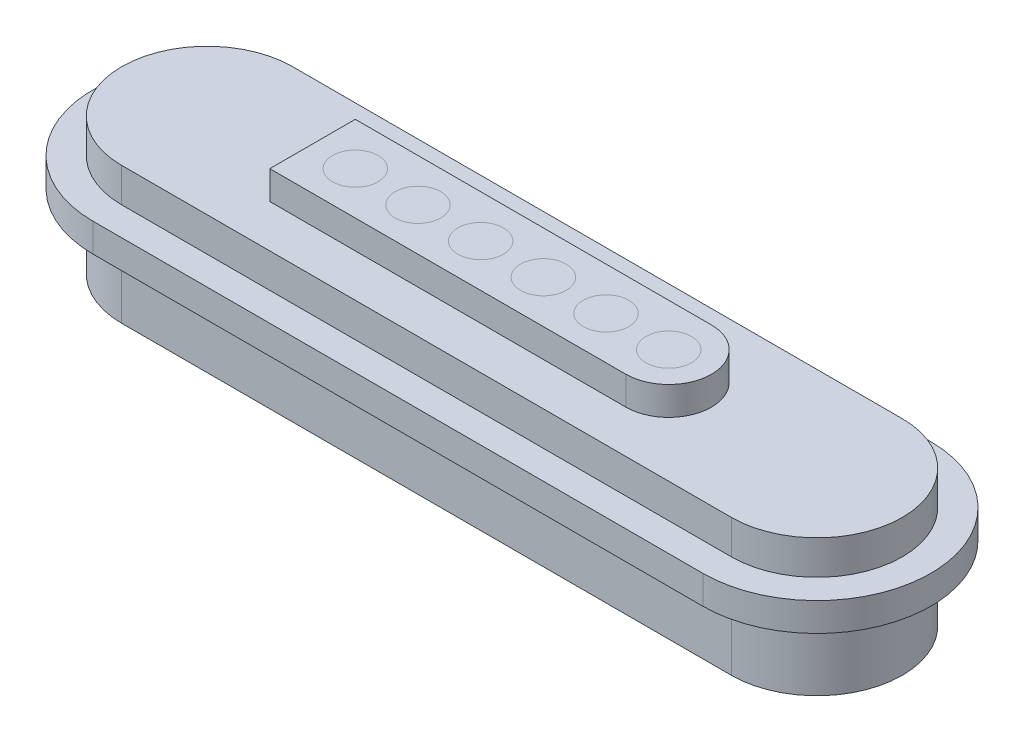
ISO-10303-21;
HEADER;
FILE_DESCRIPTION(('STEP AP214'),'2;1');
FILE_NAME('part.step','',(''),(''),'','','');
FILE_SCHEMA(('AUTOMOTIVE_DESIGN { 1 0 10303 214 1 1 1 1 }'));
ENDSEC;
DATA;
#1=APPLICATION_CONTEXT('core data for automotive mechanical design processes');
#2=APPLICATION_PROTOCOL_DEFINITION('international standard','automotive_design',2000,#1);
#3=PRODUCT_CONTEXT('',#1,'mechanical');
#4=PRODUCT('Part','Part','',(#3));
#5=PRODUCT_RELATED_PRODUCT_CATEGORY('part','',(#4));
#6=PRODUCT_DEFINITION_FORMATION('','',#4);
#7=PRODUCT_DEFINITION_CONTEXT('part definition',#1,'design');
#8=PRODUCT_DEFINITION('design','',#6,#7);
#9=PRODUCT_DEFINITION_SHAPE('','',#8);
#10=(LENGTH_UNIT() NAMED_UNIT(*) SI_UNIT(.MILLI.,.METRE.));
#11=(NAMED_UNIT(*) PLANE_ANGLE_UNIT() SI_UNIT($,.RADIAN.));
#12=(NAMED_UNIT(*) SI_UNIT($,.STERADIAN.) SOLID_ANGLE_UNIT());
#13=UNCERTAINTY_MEASURE_WITH_UNIT(LENGTH_MEASURE(1.E-05),#10,'distance_accuracy_value','');
#14=(GEOMETRIC_REPRESENTATION_CONTEXT(3) GLOBAL_UNCERTAINTY_ASSIGNED_CONTEXT((#13)) GLOBAL_UNIT_ASSIGNED_CONTEXT((#10,
#11,#12)) REPRESENTATION_CONTEXT('',''));
#15=CARTESIAN_POINT('',(0.,0.,0.));
#16=DIRECTION('',(0.,0.,1.));
#17=DIRECTION('',(1.,0.,0.));
#18=AXIS2_PLACEMENT_3D('',#15,#16,#17);
#19=CARTESIAN_POINT('',(16.2,-1.5,0.));
#20=DIRECTION('',(0.,1.,0.));
#21=DIRECTION('',(0.,0.,1.));
#22=AXIS2_PLACEMENT_3D('',#19,#20,#21);
#23=CYLINDRICAL_SURFACE('',#22,0.799999999999999);
#24=CARTESIAN_POINT('',(16.2,-1.5,0.));
#25=DIRECTION('',(0.,1.,0.));
#26=DIRECTION('',(0.,0.,1.));
#27=AXIS2_PLACEMENT_3D('',#24,#25,#26);
#28=CIRCLE('',#27,0.799999999999999);
#29=CARTESIAN_POINT('',(16.2,-1.5,0.799999999999999));
#30=VERTEX_POINT('',#29);
#31=EDGE_CURVE('E11',#30,#30,#28,.T.);
#32=ORIENTED_EDGE('',*,*,#31,.T.);
#33=EDGE_LOOP('',(#32));
#34=FACE_BOUND('',#33,.T.);
#35=CARTESIAN_POINT('',(16.2,5.8,0.));
#36=DIRECTION('',(0.,1.,0.));
#37=DIRECTION('',(0.,0.,1.));
#38=AXIS2_PLACEMENT_3D('',#35,#36,#37);
#39=CIRCLE('',#38,0.799999999999999);
#40=CARTESIAN_POINT('',(16.2,5.8,0.799999999999999));
#41=VERTEX_POINT('',#40);
#42=EDGE_CURVE('E56',#41,#41,#39,.T.);
#43=ORIENTED_EDGE('',*,*,#42,.F.);
#44=EDGE_LOOP('',(#43));
#45=FACE_BOUND('',#44,.T.);
#46=ADVANCED_FACE('F50',(#34,#45),#23,.T.);
#47=CARTESIAN_POINT('',(0.,-1.5,0.));
#48=DIRECTION('',(0.,1.,0.));
#49=DIRECTION('',(0.,0.,1.));
#50=AXIS2_PLACEMENT_3D('',#47,#48,#49);
#51=PLANE('',#50);
#52=ORIENTED_EDGE('',*,*,#31,.F.);
#53=EDGE_LOOP('',(#52));
#54=FACE_BOUND('',#53,.T.);
#55=ADVANCED_FACE('F65',(#54),#51,.F.);
#56=CARTESIAN_POINT('',(0.,5.8,0.));
#57=DIRECTION('',(0.,1.,0.));
#58=DIRECTION('',(0.,0.,1.));
#59=AXIS2_PLACEMENT_3D('',#56,#57,#58);
#60=PLANE('',#59);
#61=ORIENTED_EDGE('',*,*,#42,.T.);
#62=EDGE_LOOP('',(#61));
#63=FACE_BOUND('',#62,.T.);
#64=ADVANCED_FACE('F62',(#63),#60,.T.);
#65=CLOSED_SHELL('',(#46,#55,#64));
#66=MANIFOLD_SOLID_BREP('B2',#65);
#67=CARTESIAN_POINT('',(14.,-1.5,0.));
#68=DIRECTION('',(0.,1.,0.));
#69=DIRECTION('',(0.,0.,1.));
#70=AXIS2_PLACEMENT_3D('',#67,#68,#69);
#71=CYLINDRICAL_SURFACE('',#70,0.800000000000001);
#72=CARTESIAN_POINT('',(14.,-1.5,0.));
#73=DIRECTION('',(0.,1.,0.));
#74=DIRECTION('',(0.,0.,1.));
#75=AXIS2_PLACEMENT_3D('',#72,#73,#74);
#76=CIRCLE('',#75,0.800000000000001);
#77=CARTESIAN_POINT('',(14.,-1.5,0.800000000000001));
#78=VERTEX_POINT('',#77);
#79=EDGE_CURVE('E49',#78,#78,#76,.T.);
#80=ORIENTED_EDGE('',*,*,#79,.T.);
#81=EDGE_LOOP('',(#80));
#82=FACE_BOUND('',#81,.T.);
#83=CARTESIAN_POINT('',(14.,5.8,0.));
#84=DIRECTION('',(0.,1.,0.));
#85=DIRECTION('',(0.,0.,1.));
#86=AXIS2_PLACEMENT_3D('',#83,#84,#85);
#87=CIRCLE('',#86,0.800000000000001);
#88=CARTESIAN_POINT('',(14.,5.8,0.800000000000001));
#89=VERTEX_POINT('',#88);
#90=EDGE_CURVE('E107',#89,#89,#87,.T.);
#91=ORIENTED_EDGE('',*,*,#90,.F.);
#92=EDGE_LOOP('',(#91));
#93=FACE_BOUND('',#92,.T.);
#94=ADVANCED_FACE('F101',(#82,#93),#71,.T.);
#95=CARTESIAN_POINT('',(0.,-1.5,0.));
#96=DIRECTION('',(0.,1.,0.));
#97=DIRECTION('',(0.,0.,1.));
#98=AXIS2_PLACEMENT_3D('',#95,#96,#97);
#99=PLANE('',#98);
#100=ORIENTED_EDGE('',*,*,#79,.F.);
#101=EDGE_LOOP('',(#100));
#102=FACE_BOUND('',#101,.T.);
#103=ADVANCED_FACE('F116',(#102),#99,.F.);
#104=CARTESIAN_POINT('',(0.,5.8,0.));
#105=DIRECTION('',(0.,1.,0.));
#106=DIRECTION('',(0.,0.,1.));
#107=AXIS2_PLACEMENT_3D('',#104,#105,#106);
#108=PLANE('',#107);
#109=ORIENTED_EDGE('',*,*,#90,.T.);
#110=EDGE_LOOP('',(#109));
#111=FACE_BOUND('',#110,.T.);
#112=ADVANCED_FACE('F113',(#111),#108,.T.);
#113=CLOSED_SHELL('',(#94,#103,#112));
#114=MANIFOLD_SOLID_BREP('B6',#113);
#115=CARTESIAN_POINT('',(11.8,-1.5,0.));
#116=DIRECTION('',(0.,1.,0.));
#117=DIRECTION('',(0.,0.,1.));
#118=AXIS2_PLACEMENT_3D('',#115,#116,#117);
#119=CYLINDRICAL_SURFACE('',#118,0.800000000000001);
#120=CARTESIAN_POINT('',(11.8,-1.5,0.));
#121=DIRECTION('',(0.,1.,0.));
#122=DIRECTION('',(0.,0.,1.));
#123=AXIS2_PLACEMENT_3D('',#120,#121,#122);
#124=CIRCLE('',#123,0.800000000000001);
#125=CARTESIAN_POINT('',(11.8,-1.5,0.800000000000001));
#126=VERTEX_POINT('',#125);
#127=EDGE_CURVE('E100',#126,#126,#124,.T.);
#128=ORIENTED_EDGE('',*,*,#127,.T.);
#129=EDGE_LOOP('',(#128));
#130=FACE_BOUND('',#129,.T.);
#131=CARTESIAN_POINT('',(11.8,5.8,0.));
#132=DIRECTION('',(0.,1.,0.));
#133=DIRECTION('',(0.,0.,1.));
#134=AXIS2_PLACEMENT_3D('',#131,#132,#133);
#135=CIRCLE('',#134,0.800000000000001);
#136=CARTESIAN_POINT('',(11.8,5.8,0.800000000000001));
#137=VERTEX_POINT('',#136);
#138=EDGE_CURVE('E158',#137,#137,#135,.T.);
#139=ORIENTED_EDGE('',*,*,#138,.F.);
#140=EDGE_LOOP('',(#139));
#141=FACE_BOUND('',#140,.T.);
#142=ADVANCED_FACE('F152',(#130,#141),#119,.T.);
#143=CARTESIAN_POINT('',(0.,-1.5,0.));
#144=DIRECTION('',(0.,1.,0.));
#145=DIRECTION('',(0.,0.,1.));
#146=AXIS2_PLACEMENT_3D('',#143,#144,#145);
#147=PLANE('',#146);
#148=ORIENTED_EDGE('',*,*,#127,.F.);
#149=EDGE_LOOP('',(#148));
#150=FACE_BOUND('',#149,.T.);
#151=ADVANCED_FACE('F167',(#150),#147,.F.);
#152=CARTESIAN_POINT('',(0.,5.8,0.));
#153=DIRECTION('',(0.,1.,0.));
#154=DIRECTION('',(0.,0.,1.));
#155=AXIS2_PLACEMENT_3D('',#152,#153,#154);
#156=PLANE('',#155);
#157=ORIENTED_EDGE('',*,*,#138,.T.);
#158=EDGE_LOOP('',(#157));
#159=FACE_BOUND('',#158,.T.);
#160=ADVANCED_FACE('F164',(#159),#156,.T.);
#161=CLOSED_SHELL('',(#142,#151,#160));
#162=MANIFOLD_SOLID_BREP('B44',#161);
#163=CARTESIAN_POINT('',(9.6,-1.5,0.));
#164=DIRECTION('',(0.,1.,0.));
#165=DIRECTION('',(0.,0.,1.));
#166=AXIS2_PLACEMENT_3D('',#163,#164,#165);
#167=CYLINDRICAL_SURFACE('',#166,0.800000000000001);
#168=CARTESIAN_POINT('',(9.6,-1.5,0.));
#169=DIRECTION('',(0.,1.,0.));
#170=DIRECTION('',(0.,0.,1.));
#171=AXIS2_PLACEMENT_3D('',#168,#169,#170);
#172=CIRCLE('',#171,0.800000000000001);
#173=CARTESIAN_POINT('',(9.6,-1.5,0.800000000000001));
#174=VERTEX_POINT('',#173);
#175=EDGE_CURVE('E151',#174,#174,#172,.F.);
#176=ORIENTED_EDGE('',*,*,#175,.F.);
#177=EDGE_LOOP('',(#176));
#178=FACE_BOUND('',#177,.T.);
#179=CARTESIAN_POINT('',(9.6,5.8,0.));
#180=DIRECTION('',(0.,1.,0.));
#181=DIRECTION('',(0.,0.,1.));
#182=AXIS2_PLACEMENT_3D('',#179,#180,#181);
#183=CIRCLE('',#182,0.800000000000001);
#184=CARTESIAN_POINT('',(9.6,5.8,0.800000000000001));
#185=VERTEX_POINT('',#184);
#186=EDGE_CURVE('E209',#185,#185,#183,.F.);
#187=ORIENTED_EDGE('',*,*,#186,.T.);
#188=EDGE_LOOP('',(#187));
#189=FACE_BOUND('',#188,.T.);
#190=ADVANCED_FACE('F203',(#178,#189),#167,.T.);
#191=CARTESIAN_POINT('',(0.,-1.5,0.));
#192=DIRECTION('',(0.,1.,0.));
#193=DIRECTION('',(0.,0.,1.));
#194=AXIS2_PLACEMENT_3D('',#191,#192,#193);
#195=PLANE('',#194);
#196=ORIENTED_EDGE('',*,*,#175,.T.);
#197=EDGE_LOOP('',(#196));
#198=FACE_BOUND('',#197,.T.);
#199=ADVANCED_FACE('F218',(#198),#195,.F.);
#200=CARTESIAN_POINT('',(0.,5.8,0.));
#201=DIRECTION('',(0.,1.,0.));
#202=DIRECTION('',(0.,0.,1.));
#203=AXIS2_PLACEMENT_3D('',#200,#201,#202);
#204=PLANE('',#203);
#205=ORIENTED_EDGE('',*,*,#186,.F.);
#206=EDGE_LOOP('',(#205));
#207=FACE_BOUND('',#206,.T.);
#208=ADVANCED_FACE('F216',(#207),#204,.T.);
#209=CLOSED_SHELL('',(#190,#199,#208));
#210=MANIFOLD_SOLID_BREP('B95',#209);
#211=CARTESIAN_POINT('',(7.4,-1.5,0.));
#212=DIRECTION('',(0.,1.,0.));
#213=DIRECTION('',(0.,0.,1.));
#214=AXIS2_PLACEMENT_3D('',#211,#212,#213);
#215=CYLINDRICAL_SURFACE('',#214,0.800000000000001);
#216=CARTESIAN_POINT('',(7.4,-1.5,0.));
#217=DIRECTION('',(0.,1.,0.));
#218=DIRECTION('',(0.,0.,1.));
#219=AXIS2_PLACEMENT_3D('',#216,#217,#218);
#220=CIRCLE('',#219,0.800000000000001);
#221=CARTESIAN_POINT('',(7.4,-1.5,0.800000000000001));
#222=VERTEX_POINT('',#221);
#223=EDGE_CURVE('E202',#222,#222,#220,.F.);
#224=ORIENTED_EDGE('',*,*,#223,.F.);
#225=EDGE_LOOP('',(#224));
#226=FACE_BOUND('',#225,.T.);
#227=CARTESIAN_POINT('',(7.4,5.8,0.));
#228=DIRECTION('',(0.,1.,0.));
#229=DIRECTION('',(0.,0.,1.));
#230=AXIS2_PLACEMENT_3D('',#227,#228,#229);
#231=CIRCLE('',#230,0.800000000000001);
#232=CARTESIAN_POINT('',(7.4,5.8,0.800000000000001));
#233=VERTEX_POINT('',#232);
#234=EDGE_CURVE('E260',#233,#233,#231,.F.);
#235=ORIENTED_EDGE('',*,*,#234,.T.);
#236=EDGE_LOOP('',(#235));
#237=FACE_BOUND('',#236,.T.);
#238=ADVANCED_FACE('F254',(#226,#237),#215,.T.);
#239=CARTESIAN_POINT('',(0.,-1.5,0.));
#240=DIRECTION('',(0.,1.,0.));
#241=DIRECTION('',(0.,0.,1.));
#242=AXIS2_PLACEMENT_3D('',#239,#240,#241);
#243=PLANE('',#242);
#244=ORIENTED_EDGE('',*,*,#223,.T.);
#245=EDGE_LOOP('',(#244));
#246=FACE_BOUND('',#245,.T.);
#247=ADVANCED_FACE('F269',(#246),#243,.F.);
#248=CARTESIAN_POINT('',(0.,5.8,0.));
#249=DIRECTION('',(0.,1.,0.));
#250=DIRECTION('',(0.,0.,1.));
#251=AXIS2_PLACEMENT_3D('',#248,#249,#250);
#252=PLANE('',#251);
#253=ORIENTED_EDGE('',*,*,#234,.F.);
#254=EDGE_LOOP('',(#253));
#255=FACE_BOUND('',#254,.T.);
#256=ADVANCED_FACE('F267',(#255),#252,.T.);
#257=CLOSED_SHELL('',(#238,#247,#256));
#258=MANIFOLD_SOLID_BREP('B146',#257);
#259=CARTESIAN_POINT('',(5.2,-1.5,0.));
#260=DIRECTION('',(0.,1.,0.));
#261=DIRECTION('',(0.,0.,1.));
#262=AXIS2_PLACEMENT_3D('',#259,#260,#261);
#263=CYLINDRICAL_SURFACE('',#262,0.800000000000001);
#264=CARTESIAN_POINT('',(5.2,-1.5,0.));
#265=DIRECTION('',(0.,1.,0.));
#266=DIRECTION('',(0.,0.,1.));
#267=AXIS2_PLACEMENT_3D('',#264,#265,#266);
#268=CIRCLE('',#267,0.800000000000001);
#269=CARTESIAN_POINT('',(5.2,-1.5,0.800000000000001));
#270=VERTEX_POINT('',#269);
#271=EDGE_CURVE('E253',#270,#270,#268,.F.);
#272=ORIENTED_EDGE('',*,*,#271,.F.);
#273=EDGE_LOOP('',(#272));
#274=FACE_BOUND('',#273,.T.);
#275=CARTESIAN_POINT('',(5.2,5.8,0.));
#276=DIRECTION('',(0.,1.,0.));
#277=DIRECTION('',(0.,0.,1.));
#278=AXIS2_PLACEMENT_3D('',#275,#276,#277);
#279=CIRCLE('',#278,0.800000000000001);
#280=CARTESIAN_POINT('',(5.2,5.8,0.800000000000001));
#281=VERTEX_POINT('',#280);
#282=EDGE_CURVE('E312',#281,#281,#279,.F.);
#283=ORIENTED_EDGE('',*,*,#282,.T.);
#284=EDGE_LOOP('',(#283));
#285=FACE_BOUND('',#284,.T.);
#286=ADVANCED_FACE('F306',(#274,#285),#263,.T.);
#287=CARTESIAN_POINT('',(0.,-1.5,0.));
#288=DIRECTION('',(0.,1.,0.));
#289=DIRECTION('',(0.,0.,1.));
#290=AXIS2_PLACEMENT_3D('',#287,#288,#289);
#291=PLANE('',#290);
#292=ORIENTED_EDGE('',*,*,#271,.T.);
#293=EDGE_LOOP('',(#292));
#294=FACE_BOUND('',#293,.T.);
#295=ADVANCED_FACE('F321',(#294),#291,.F.);
#296=CARTESIAN_POINT('',(0.,5.8,0.));
#297=DIRECTION('',(0.,1.,0.));
#298=DIRECTION('',(0.,0.,1.));
#299=AXIS2_PLACEMENT_3D('',#296,#297,#298);
#300=PLANE('',#299);
#301=ORIENTED_EDGE('',*,*,#282,.F.);
#302=EDGE_LOOP('',(#301));
#303=FACE_BOUND('',#302,.T.);
#304=ADVANCED_FACE('F319',(#303),#300,.T.);
#305=CLOSED_SHELL('',(#286,#295,#304));
#306=MANIFOLD_SOLID_BREP('B197',#305);
#307=CARTESIAN_POINT('',(0.,4.8,3.));
#308=DIRECTION('',(0.,0.,-1.));
#309=DIRECTION('',(-1.,0.,0.));
#310=AXIS2_PLACEMENT_3D('',#307,#308,#309);
#311=PLANE('',#310);
#312=DIRECTION('',(1.,0.,0.));
#313=VECTOR('',#312,1.);
#314=CARTESIAN_POINT('',(0.,2.6,3.));
#315=LINE('',#314,#313);
#316=CARTESIAN_POINT('',(0.,2.6,3.));
#317=VERTEX_POINT('',#316);
#318=CARTESIAN_POINT('',(21.4,2.6,3.));
#319=VERTEX_POINT('',#318);
#320=EDGE_CURVE('E558',#317,#319,#315,.T.);
#321=ORIENTED_EDGE('',*,*,#320,.F.);
#322=DIRECTION('',(0.,-1.,0.));
#323=VECTOR('',#322,1.);
#324=CARTESIAN_POINT('',(0.,4.8,3.));
#325=LINE('',#324,#323);
#326=CARTESIAN_POINT('',(0.,0.,3.));
#327=VERTEX_POINT('',#326);
#328=EDGE_CURVE('E520',#317,#327,#325,.T.);
#329=ORIENTED_EDGE('',*,*,#328,.T.);
#330=DIRECTION('',(1.,0.,0.));
#331=VECTOR('',#330,1.);
#332=CARTESIAN_POINT('',(0.,0.,3.));
#333=LINE('',#332,#331);
#334=CARTESIAN_POINT('',(21.4,0.,3.));
#335=VERTEX_POINT('',#334);
#336=EDGE_CURVE('E521',#327,#335,#333,.T.);
#337=ORIENTED_EDGE('',*,*,#336,.T.);
#338=DIRECTION('',(0.,-1.,0.));
#339=VECTOR('',#338,1.);
#340=CARTESIAN_POINT('',(21.4,4.8,3.));
#341=LINE('',#340,#339);
#342=EDGE_CURVE('E357',#319,#335,#341,.T.);
#343=ORIENTED_EDGE('',*,*,#342,.F.);
#344=EDGE_LOOP('',(#321,#329,#337,#343));
#345=FACE_BOUND('',#344,.T.);
#346=ADVANCED_FACE('F349',(#345),#311,.F.);
#347=CARTESIAN_POINT('',(21.4,4.8,0.));
#348=DIRECTION('',(0.,-1.,0.));
#349=DIRECTION('',(0.,0.,-1.));
#350=AXIS2_PLACEMENT_3D('',#347,#348,#349);
#351=CYLINDRICAL_SURFACE('',#350,3.);
#352=CARTESIAN_POINT('',(21.4,2.6,0.));
#353=DIRECTION('',(0.,1.,0.));
#354=DIRECTION('',(0.,0.,1.));
#355=AXIS2_PLACEMENT_3D('',#352,#353,#354);
#356=CIRCLE('',#355,3.);
#357=CARTESIAN_POINT('',(21.4,2.6,-3.));
#358=VERTEX_POINT('',#357);
#359=EDGE_CURVE('E364',#319,#358,#356,.T.);
#360=ORIENTED_EDGE('',*,*,#359,.F.);
#361=ORIENTED_EDGE('',*,*,#342,.T.);
#362=CARTESIAN_POINT('',(21.4,0.,0.));
#363=DIRECTION('',(0.,1.,0.));
#364=DIRECTION('',(0.,0.,1.));
#365=AXIS2_PLACEMENT_3D('',#362,#363,#364);
#366=CIRCLE('',#365,3.);
#367=CARTESIAN_POINT('',(21.4,0.,-3.));
#368=VERTEX_POINT('',#367);
#369=EDGE_CURVE('E524',#335,#368,#366,.T.);
#370=ORIENTED_EDGE('',*,*,#369,.T.);
#371=DIRECTION('',(0.,-1.,0.));
#372=VECTOR('',#371,1.);
#373=CARTESIAN_POINT('',(21.4,4.8,-3.));
#374=LINE('',#373,#372);
#375=EDGE_CURVE('E533',#358,#368,#374,.T.);
#376=ORIENTED_EDGE('',*,*,#375,.F.);
#377=EDGE_LOOP('',(#360,#361,#370,#376));
#378=FACE_BOUND('',#377,.T.);
#379=ADVANCED_FACE('F538',(#378),#351,.T.);
#380=CARTESIAN_POINT('',(0.,4.8,-3.));
#381=DIRECTION('',(0.,0.,-1.));
#382=DIRECTION('',(-1.,0.,0.));
#383=AXIS2_PLACEMENT_3D('',#380,#381,#382);
#384=PLANE('',#383);
#385=DIRECTION('',(0.,-1.,0.));
#386=VECTOR('',#385,1.);
#387=CARTESIAN_POINT('',(0.,4.8,-3.));
#388=LINE('',#387,#386);
#389=CARTESIAN_POINT('',(0.,2.6,-3.));
#390=VERTEX_POINT('',#389);
#391=CARTESIAN_POINT('',(0.,0.,-3.));
#392=VERTEX_POINT('',#391);
#393=EDGE_CURVE('E530',#390,#392,#388,.T.);
#394=ORIENTED_EDGE('',*,*,#393,.F.);
#395=DIRECTION('',(1.,0.,0.));
#396=VECTOR('',#395,1.);
#397=CARTESIAN_POINT('',(0.,2.6,-3.));
#398=LINE('',#397,#396);
#399=EDGE_CURVE('E372',#390,#358,#398,.T.);
#400=ORIENTED_EDGE('',*,*,#399,.T.);
#401=ORIENTED_EDGE('',*,*,#375,.T.);
#402=DIRECTION('',(1.,0.,0.));
#403=VECTOR('',#402,1.);
#404=CARTESIAN_POINT('',(0.,0.,-3.));
#405=LINE('',#404,#403);
#406=EDGE_CURVE('E500',#392,#368,#405,.T.);
#407=ORIENTED_EDGE('',*,*,#406,.F.);
#408=EDGE_LOOP('',(#394,#400,#401,#407));
#409=FACE_BOUND('',#408,.T.);
#410=ADVANCED_FACE('F536',(#409),#384,.T.);
#411=CARTESIAN_POINT('',(0.,4.8,0.));
#412=DIRECTION('',(0.,-1.,0.));
#413=DIRECTION('',(0.,0.,-1.));
#414=AXIS2_PLACEMENT_3D('',#411,#412,#413);
#415=CYLINDRICAL_SURFACE('',#414,3.);
#416=CARTESIAN_POINT('',(0.,2.6,0.));
#417=DIRECTION('',(0.,1.,0.));
#418=DIRECTION('',(0.,0.,1.));
#419=AXIS2_PLACEMENT_3D('',#416,#417,#418);
#420=CIRCLE('',#419,3.);
#421=EDGE_CURVE('E548',#390,#317,#420,.T.);
#422=ORIENTED_EDGE('',*,*,#421,.F.);
#423=ORIENTED_EDGE('',*,*,#393,.T.);
#424=CARTESIAN_POINT('',(0.,0.,0.));
#425=DIRECTION('',(0.,1.,0.));
#426=DIRECTION('',(0.,0.,1.));
#427=AXIS2_PLACEMENT_3D('',#424,#425,#426);
#428=CIRCLE('',#427,3.);
#429=EDGE_CURVE('E497',#392,#327,#428,.T.);
#430=ORIENTED_EDGE('',*,*,#429,.T.);
#431=ORIENTED_EDGE('',*,*,#328,.F.);
#432=EDGE_LOOP('',(#422,#423,#430,#431));
#433=FACE_BOUND('',#432,.T.);
#434=ADVANCED_FACE('F545',(#433),#415,.T.);
#435=CARTESIAN_POINT('',(0.,4.8,3.));
#436=VERTEX_POINT('',#435);
#437=CARTESIAN_POINT('',(0.,3.6,3.));
#438=VERTEX_POINT('',#437);
#439=EDGE_CURVE('E480',#436,#438,#325,.T.);
#440=ORIENTED_EDGE('',*,*,#439,.T.);
#441=DIRECTION('',(1.,0.,0.));
#442=VECTOR('',#441,1.);
#443=CARTESIAN_POINT('',(0.,3.6,3.));
#444=LINE('',#443,#442);
#445=CARTESIAN_POINT('',(21.4,3.6,3.));
#446=VERTEX_POINT('',#445);
#447=EDGE_CURVE('E466',#438,#446,#444,.T.);
#448=ORIENTED_EDGE('',*,*,#447,.T.);
#449=CARTESIAN_POINT('',(21.4,4.8,3.));
#450=VERTEX_POINT('',#449);
#451=EDGE_CURVE('E304',#450,#446,#341,.T.);
#452=ORIENTED_EDGE('',*,*,#451,.F.);
#453=DIRECTION('',(1.,0.,0.));
#454=VECTOR('',#453,1.);
#455=CARTESIAN_POINT('',(0.,4.8,3.));
#456=LINE('',#455,#454);
#457=EDGE_CURVE('E491',#436,#450,#456,.T.);
#458=ORIENTED_EDGE('',*,*,#457,.F.);
#459=EDGE_LOOP('',(#440,#448,#452,#458));
#460=FACE_BOUND('',#459,.T.);
#461=ADVANCED_FACE('F351',(#460),#311,.F.);
#462=ORIENTED_EDGE('',*,*,#451,.T.);
#463=CARTESIAN_POINT('',(21.4,3.6,0.));
#464=DIRECTION('',(0.,1.,0.));
#465=DIRECTION('',(0.,0.,1.));
#466=AXIS2_PLACEMENT_3D('',#463,#464,#465);
#467=CIRCLE('',#466,3.);
#468=CARTESIAN_POINT('',(21.4,3.6,-3.));
#469=VERTEX_POINT('',#468);
#470=EDGE_CURVE('E462',#446,#469,#467,.T.);
#471=ORIENTED_EDGE('',*,*,#470,.T.);
#472=CARTESIAN_POINT('',(21.4,4.8,-3.));
#473=VERTEX_POINT('',#472);
#474=EDGE_CURVE('E486',#473,#469,#374,.T.);
#475=ORIENTED_EDGE('',*,*,#474,.F.);
#476=CARTESIAN_POINT('',(21.4,4.8,0.));
#477=DIRECTION('',(0.,1.,0.));
#478=DIRECTION('',(0.,0.,1.));
#479=AXIS2_PLACEMENT_3D('',#476,#477,#478);
#480=CIRCLE('',#479,3.);
#481=EDGE_CURVE('E484',#450,#473,#480,.T.);
#482=ORIENTED_EDGE('',*,*,#481,.F.);
#483=EDGE_LOOP('',(#462,#471,#475,#482));
#484=FACE_BOUND('',#483,.T.);
#485=ADVANCED_FACE('F483',(#484),#351,.T.);
#486=DIRECTION('',(1.,0.,0.));
#487=VECTOR('',#486,1.);
#488=CARTESIAN_POINT('',(0.,3.6,-3.));
#489=LINE('',#488,#487);
#490=CARTESIAN_POINT('',(0.,3.6,-3.));
#491=VERTEX_POINT('',#490);
#492=EDGE_CURVE('E469',#491,#469,#489,.T.);
#493=ORIENTED_EDGE('',*,*,#492,.F.);
#494=CARTESIAN_POINT('',(0.,4.8,-3.));
#495=VERTEX_POINT('',#494);
#496=EDGE_CURVE('E531',#495,#491,#388,.T.);
#497=ORIENTED_EDGE('',*,*,#496,.F.);
#498=DIRECTION('',(1.,0.,0.));
#499=VECTOR('',#498,1.);
#500=CARTESIAN_POINT('',(0.,4.8,-3.));
#501=LINE('',#500,#499);
#502=EDGE_CURVE('E490',#495,#473,#501,.T.);
#503=ORIENTED_EDGE('',*,*,#502,.T.);
#504=ORIENTED_EDGE('',*,*,#474,.T.);
#505=EDGE_LOOP('',(#493,#497,#503,#504));
#506=FACE_BOUND('',#505,.T.);
#507=ADVANCED_FACE('F669',(#506),#384,.T.);
#508=ORIENTED_EDGE('',*,*,#496,.T.);
#509=CARTESIAN_POINT('',(0.,3.6,0.));
#510=DIRECTION('',(0.,1.,0.));
#511=DIRECTION('',(0.,0.,1.));
#512=AXIS2_PLACEMENT_3D('',#509,#510,#511);
#513=CIRCLE('',#512,3.);
#514=EDGE_CURVE('E481',#491,#438,#513,.T.);
#515=ORIENTED_EDGE('',*,*,#514,.T.);
#516=ORIENTED_EDGE('',*,*,#439,.F.);
#517=CARTESIAN_POINT('',(0.,4.8,0.));
#518=DIRECTION('',(0.,1.,0.));
#519=DIRECTION('',(0.,0.,1.));
#520=AXIS2_PLACEMENT_3D('',#517,#518,#519);
#521=CIRCLE('',#520,3.);
#522=EDGE_CURVE('E496',#495,#436,#521,.T.);
#523=ORIENTED_EDGE('',*,*,#522,.F.);
#524=EDGE_LOOP('',(#508,#515,#516,#523));
#525=FACE_BOUND('',#524,.T.);
#526=ADVANCED_FACE('F671',(#525),#415,.T.);
#527=CARTESIAN_POINT('',(0.,4.8,0.));
#528=DIRECTION('',(0.,1.,0.));
#529=DIRECTION('',(0.,0.,1.));
#530=AXIS2_PLACEMENT_3D('',#527,#528,#529);
#531=PLANE('',#530);
#532=ORIENTED_EDGE('',*,*,#457,.T.);
#533=ORIENTED_EDGE('',*,*,#481,.T.);
#534=ORIENTED_EDGE('',*,*,#502,.F.);
#535=ORIENTED_EDGE('',*,*,#522,.T.);
#536=EDGE_LOOP('',(#532,#533,#534,#535));
#537=FACE_BOUND('',#536,.T.);
#538=DIRECTION('',(1.,0.,0.));
#539=VECTOR('',#538,1.);
#540=CARTESIAN_POINT('',(0.,4.8,-1.49993524145095));
#541=LINE('',#540,#539);
#542=CARTESIAN_POINT('',(3.69998380943219,4.8,-1.49993524145095));
#543=VERTEX_POINT('',#542);
#544=CARTESIAN_POINT('',(16.213938129483,4.8,-1.49993524145095));
#545=VERTEX_POINT('',#544);
#546=EDGE_CURVE('E508',#543,#545,#541,.T.);
#547=ORIENTED_EDGE('',*,*,#546,.T.);
#548=CARTESIAN_POINT('',(16.2,4.8,0.));
#549=DIRECTION('',(0.,1.,0.));
#550=DIRECTION('',(0.,0.,1.));
#551=AXIS2_PLACEMENT_3D('',#548,#549,#550);
#552=CIRCLE('',#551,1.5);
#553=CARTESIAN_POINT('',(16.1999996370451,4.8,1.49999999999996));
#554=VERTEX_POINT('',#553);
#555=EDGE_CURVE('E511',#545,#554,#552,.F.);
#556=ORIENTED_EDGE('',*,*,#555,.T.);
#557=DIRECTION('',(-0.999999999999971,0.,-2.41969910881191E-07));
#558=VECTOR('',#557,1.);
#559=CARTESIAN_POINT('',(-3.62953917820895E-07,4.8,1.4999960800874));
#560=LINE('',#559,#558);
#561=CARTESIAN_POINT('',(3.69998380943219,4.8,1.49999697537224));
#562=VERTEX_POINT('',#561);
#563=EDGE_CURVE('E514',#554,#562,#560,.T.);
#564=ORIENTED_EDGE('',*,*,#563,.T.);
#565=DIRECTION('',(0.,0.,-1.));
#566=VECTOR('',#565,1.);
#567=CARTESIAN_POINT('',(3.69998380943219,4.8,0.));
#568=LINE('',#567,#566);
#569=EDGE_CURVE('E517',#562,#543,#568,.T.);
#570=ORIENTED_EDGE('',*,*,#569,.T.);
#571=EDGE_LOOP('',(#547,#556,#564,#570));
#572=FACE_BOUND('',#571,.T.);
#573=ADVANCED_FACE('F493',(#537,#572),#531,.T.);
#574=CARTESIAN_POINT('',(0.,0.,0.));
#575=DIRECTION('',(0.,1.,0.));
#576=DIRECTION('',(0.,0.,1.));
#577=AXIS2_PLACEMENT_3D('',#574,#575,#576);
#578=PLANE('',#577);
#579=ORIENTED_EDGE('',*,*,#336,.F.);
#580=ORIENTED_EDGE('',*,*,#429,.F.);
#581=ORIENTED_EDGE('',*,*,#406,.T.);
#582=ORIENTED_EDGE('',*,*,#369,.F.);
#583=EDGE_LOOP('',(#579,#580,#581,#582));
#584=FACE_BOUND('',#583,.T.);
#585=CARTESIAN_POINT('',(7.4,0.,0.));
#586=DIRECTION('',(0.,1.,0.));
#587=DIRECTION('',(0.,0.,1.));
#588=AXIS2_PLACEMENT_3D('',#585,#586,#587);
#589=CIRCLE('',#588,0.800000000000001);
#590=CARTESIAN_POINT('',(7.4,0.,0.800000000000001));
#591=VERTEX_POINT('',#590);
#592=EDGE_CURVE('E579',#591,#591,#589,.F.);
#593=ORIENTED_EDGE('',*,*,#592,.F.);
#594=EDGE_LOOP('',(#593));
#595=FACE_BOUND('',#594,.T.);
#596=CARTESIAN_POINT('',(11.8,0.,0.));
#597=DIRECTION('',(0.,1.,0.));
#598=DIRECTION('',(0.,0.,1.));
#599=AXIS2_PLACEMENT_3D('',#596,#597,#598);
#600=CIRCLE('',#599,0.800000000000001);
#601=CARTESIAN_POINT('',(11.8,0.,0.800000000000001));
#602=VERTEX_POINT('',#601);
#603=EDGE_CURVE('E614',#602,#602,#600,.T.);
#604=ORIENTED_EDGE('',*,*,#603,.T.);
#605=EDGE_LOOP('',(#604));
#606=FACE_BOUND('',#605,.T.);
#607=CARTESIAN_POINT('',(14.,0.,0.));
#608=DIRECTION('',(0.,1.,0.));
#609=DIRECTION('',(0.,0.,1.));
#610=AXIS2_PLACEMENT_3D('',#607,#608,#609);
#611=CIRCLE('',#610,0.800000000000001);
#612=CARTESIAN_POINT('',(14.,0.,0.800000000000001));
#613=VERTEX_POINT('',#612);
#614=EDGE_CURVE('E617',#613,#613,#611,.T.);
#615=ORIENTED_EDGE('',*,*,#614,.T.);
#616=EDGE_LOOP('',(#615));
#617=FACE_BOUND('',#616,.T.);
#618=CARTESIAN_POINT('',(16.2,0.,0.));
#619=DIRECTION('',(0.,1.,0.));
#620=DIRECTION('',(0.,0.,1.));
#621=AXIS2_PLACEMENT_3D('',#618,#619,#620);
#622=CIRCLE('',#621,0.799999999999999);
#623=CARTESIAN_POINT('',(16.2,0.,0.799999999999999));
#624=VERTEX_POINT('',#623);
#625=EDGE_CURVE('E620',#624,#624,#622,.T.);
#626=ORIENTED_EDGE('',*,*,#625,.T.);
#627=EDGE_LOOP('',(#626));
#628=FACE_BOUND('',#627,.T.);
#629=CARTESIAN_POINT('',(5.2,0.,0.));
#630=DIRECTION('',(0.,1.,0.));
#631=DIRECTION('',(0.,0.,1.));
#632=AXIS2_PLACEMENT_3D('',#629,#630,#631);
#633=CIRCLE('',#632,0.800000000000001);
#634=CARTESIAN_POINT('',(5.2,0.,0.800000000000001));
#635=VERTEX_POINT('',#634);
#636=EDGE_CURVE('E623',#635,#635,#633,.F.);
#637=ORIENTED_EDGE('',*,*,#636,.F.);
#638=EDGE_LOOP('',(#637));
#639=FACE_BOUND('',#638,.T.);
#640=CARTESIAN_POINT('',(9.6,0.,0.));
#641=DIRECTION('',(0.,1.,0.));
#642=DIRECTION('',(0.,0.,1.));
#643=AXIS2_PLACEMENT_3D('',#640,#641,#642);
#644=CIRCLE('',#643,0.800000000000001);
#645=CARTESIAN_POINT('',(9.6,0.,0.800000000000001));
#646=VERTEX_POINT('',#645);
#647=EDGE_CURVE('E584',#646,#646,#644,.F.);
#648=ORIENTED_EDGE('',*,*,#647,.F.);
#649=EDGE_LOOP('',(#648));
#650=FACE_BOUND('',#649,.T.);
#651=ADVANCED_FACE('F542',(#584,#595,#606,#617,#628,#639,#650),#578,.F.);
#652=CARTESIAN_POINT('',(16.2,5.8,0.));
#653=DIRECTION('',(0.,-1.,0.));
#654=DIRECTION('',(0.,0.,-1.));
#655=AXIS2_PLACEMENT_3D('',#652,#653,#654);
#656=CYLINDRICAL_SURFACE('',#655,1.5);
#657=DIRECTION('',(0.,-1.,0.));
#658=VECTOR('',#657,1.);
#659=CARTESIAN_POINT('',(16.1999996370451,5.8,1.49999999999996));
#660=LINE('',#659,#658);
#661=CARTESIAN_POINT('',(16.1999996370451,5.8,1.49999999999996));
#662=VERTEX_POINT('',#661);
#663=EDGE_CURVE('E611',#662,#554,#660,.T.);
#664=ORIENTED_EDGE('',*,*,#663,.T.);
#665=ORIENTED_EDGE('',*,*,#555,.F.);
#666=DIRECTION('',(0.,-1.,0.));
#667=VECTOR('',#666,1.);
#668=CARTESIAN_POINT('',(16.213938129483,5.8,-1.49993524145095));
#669=LINE('',#668,#667);
#670=CARTESIAN_POINT('',(16.213938129483,5.8,-1.49993524145095));
#671=VERTEX_POINT('',#670);
#672=EDGE_CURVE('E503',#671,#545,#669,.T.);
#673=ORIENTED_EDGE('',*,*,#672,.F.);
#674=CARTESIAN_POINT('',(16.2,5.8,0.));
#675=DIRECTION('',(0.,1.,0.));
#676=DIRECTION('',(0.,0.,1.));
#677=AXIS2_PLACEMENT_3D('',#674,#675,#676);
#678=CIRCLE('',#677,1.5);
#679=EDGE_CURVE('E580',#671,#662,#678,.F.);
#680=ORIENTED_EDGE('',*,*,#679,.T.);
#681=EDGE_LOOP('',(#664,#665,#673,#680));
#682=FACE_BOUND('',#681,.T.);
#683=ADVANCED_FACE('F649',(#682),#656,.T.);
#684=CARTESIAN_POINT('',(0.,5.8,-1.49993524145095));
#685=DIRECTION('',(0.,0.,-1.));
#686=DIRECTION('',(-1.,0.,0.));
#687=AXIS2_PLACEMENT_3D('',#684,#685,#686);
#688=PLANE('',#687);
#689=ORIENTED_EDGE('',*,*,#672,.T.);
#690=ORIENTED_EDGE('',*,*,#546,.F.);
#691=DIRECTION('',(0.,-1.,0.));
#692=VECTOR('',#691,1.);
#693=CARTESIAN_POINT('',(3.69998380943219,5.8,-1.49993524145095));
#694=LINE('',#693,#692);
#695=CARTESIAN_POINT('',(3.69998380943219,5.8,-1.49993524145095));
#696=VERTEX_POINT('',#695);
#697=EDGE_CURVE('E631',#696,#543,#694,.T.);
#698=ORIENTED_EDGE('',*,*,#697,.F.);
#699=DIRECTION('',(1.,0.,0.));
#700=VECTOR('',#699,1.);
#701=CARTESIAN_POINT('',(0.,5.8,-1.49993524145095));
#702=LINE('',#701,#700);
#703=EDGE_CURVE('E583',#696,#671,#702,.T.);
#704=ORIENTED_EDGE('',*,*,#703,.T.);
#705=EDGE_LOOP('',(#689,#690,#698,#704));
#706=FACE_BOUND('',#705,.T.);
#707=ADVANCED_FACE('F637',(#706),#688,.T.);
#708=CARTESIAN_POINT('',(3.69998380943219,5.8,0.));
#709=DIRECTION('',(-1.,0.,0.));
#710=DIRECTION('',(0.,0.,1.));
#711=AXIS2_PLACEMENT_3D('',#708,#709,#710);
#712=PLANE('',#711);
#713=ORIENTED_EDGE('',*,*,#697,.T.);
#714=ORIENTED_EDGE('',*,*,#569,.F.);
#715=DIRECTION('',(0.,-1.,0.));
#716=VECTOR('',#715,1.);
#717=CARTESIAN_POINT('',(3.69998380943219,5.8,1.49999697537224));
#718=LINE('',#717,#716);
#719=CARTESIAN_POINT('',(3.69998380943219,5.8,1.49999697537224));
#720=VERTEX_POINT('',#719);
#721=EDGE_CURVE('E630',#720,#562,#718,.T.);
#722=ORIENTED_EDGE('',*,*,#721,.F.);
#723=DIRECTION('',(0.,0.,-1.));
#724=VECTOR('',#723,1.);
#725=CARTESIAN_POINT('',(3.69998380943219,5.8,0.));
#726=LINE('',#725,#724);
#727=EDGE_CURVE('E587',#720,#696,#726,.T.);
#728=ORIENTED_EDGE('',*,*,#727,.T.);
#729=EDGE_LOOP('',(#713,#714,#722,#728));
#730=FACE_BOUND('',#729,.T.);
#731=ADVANCED_FACE('F641',(#730),#712,.T.);
#732=CARTESIAN_POINT('',(5.2,5.8,0.));
#733=DIRECTION('',(0.,-1.,0.));
#734=DIRECTION('',(0.,0.,-1.));
#735=AXIS2_PLACEMENT_3D('',#732,#733,#734);
#736=CYLINDRICAL_SURFACE('',#735,0.800000000000001);
#737=CARTESIAN_POINT('',(5.2,5.8,0.));
#738=DIRECTION('',(0.,1.,0.));
#739=DIRECTION('',(0.,0.,1.));
#740=AXIS2_PLACEMENT_3D('',#737,#738,#739);
#741=CIRCLE('',#740,0.800000000000001);
#742=CARTESIAN_POINT('',(5.2,5.8,0.800000000000001));
#743=VERTEX_POINT('',#742);
#744=EDGE_CURVE('E605',#743,#743,#741,.F.);
#745=ORIENTED_EDGE('',*,*,#744,.F.);
#746=EDGE_LOOP('',(#745));
#747=FACE_BOUND('',#746,.T.);
#748=ORIENTED_EDGE('',*,*,#636,.T.);
#749=EDGE_LOOP('',(#748));
#750=FACE_BOUND('',#749,.T.);
#751=ADVANCED_FACE('F732',(#747,#750),#736,.F.);
#752=CARTESIAN_POINT('',(16.2,5.8,0.));
#753=DIRECTION('',(0.,-1.,0.));
#754=DIRECTION('',(0.,0.,-1.));
#755=AXIS2_PLACEMENT_3D('',#752,#753,#754);
#756=CYLINDRICAL_SURFACE('',#755,0.799999999999999);
#757=CARTESIAN_POINT('',(16.2,5.8,0.));
#758=DIRECTION('',(0.,1.,0.));
#759=DIRECTION('',(0.,0.,1.));
#760=AXIS2_PLACEMENT_3D('',#757,#758,#759);
#761=CIRCLE('',#760,0.799999999999999);
#762=CARTESIAN_POINT('',(16.2,5.8,0.799999999999999));
#763=VERTEX_POINT('',#762);
#764=EDGE_CURVE('E602',#763,#763,#761,.T.);
#765=ORIENTED_EDGE('',*,*,#764,.T.);
#766=EDGE_LOOP('',(#765));
#767=FACE_BOUND('',#766,.T.);
#768=ORIENTED_EDGE('',*,*,#625,.F.);
#769=EDGE_LOOP('',(#768));
#770=FACE_BOUND('',#769,.T.);
#771=ADVANCED_FACE('F735',(#767,#770),#756,.F.);
#772=CARTESIAN_POINT('',(14.,5.8,0.));
#773=DIRECTION('',(0.,-1.,0.));
#774=DIRECTION('',(0.,0.,-1.));
#775=AXIS2_PLACEMENT_3D('',#772,#773,#774);
#776=CYLINDRICAL_SURFACE('',#775,0.800000000000001);
#777=CARTESIAN_POINT('',(14.,5.8,0.));
#778=DIRECTION('',(0.,1.,0.));
#779=DIRECTION('',(0.,0.,1.));
#780=AXIS2_PLACEMENT_3D('',#777,#778,#779);
#781=CIRCLE('',#780,0.800000000000001);
#782=CARTESIAN_POINT('',(14.,5.8,0.800000000000001));
#783=VERTEX_POINT('',#782);
#784=EDGE_CURVE('E599',#783,#783,#781,.T.);
#785=ORIENTED_EDGE('',*,*,#784,.T.);
#786=EDGE_LOOP('',(#785));
#787=FACE_BOUND('',#786,.T.);
#788=ORIENTED_EDGE('',*,*,#614,.F.);
#789=EDGE_LOOP('',(#788));
#790=FACE_BOUND('',#789,.T.);
#791=ADVANCED_FACE('F739',(#787,#790),#776,.F.);
#792=CARTESIAN_POINT('',(11.8,5.8,0.));
#793=DIRECTION('',(0.,-1.,0.));
#794=DIRECTION('',(0.,0.,-1.));
#795=AXIS2_PLACEMENT_3D('',#792,#793,#794);
#796=CYLINDRICAL_SURFACE('',#795,0.800000000000001);
#797=CARTESIAN_POINT('',(11.8,5.8,0.));
#798=DIRECTION('',(0.,1.,0.));
#799=DIRECTION('',(0.,0.,1.));
#800=AXIS2_PLACEMENT_3D('',#797,#798,#799);
#801=CIRCLE('',#800,0.800000000000001);
#802=CARTESIAN_POINT('',(11.8,5.8,0.800000000000001));
#803=VERTEX_POINT('',#802);
#804=EDGE_CURVE('E596',#803,#803,#801,.T.);
#805=ORIENTED_EDGE('',*,*,#804,.T.);
#806=EDGE_LOOP('',(#805));
#807=FACE_BOUND('',#806,.T.);
#808=ORIENTED_EDGE('',*,*,#603,.F.);
#809=EDGE_LOOP('',(#808));
#810=FACE_BOUND('',#809,.T.);
#811=ADVANCED_FACE('F743',(#807,#810),#796,.F.);
#812=CARTESIAN_POINT('',(7.4,5.8,0.));
#813=DIRECTION('',(0.,-1.,0.));
#814=DIRECTION('',(0.,0.,-1.));
#815=AXIS2_PLACEMENT_3D('',#812,#813,#814);
#816=CYLINDRICAL_SURFACE('',#815,0.800000000000001);
#817=CARTESIAN_POINT('',(7.4,5.8,0.));
#818=DIRECTION('',(0.,1.,0.));
#819=DIRECTION('',(0.,0.,1.));
#820=AXIS2_PLACEMENT_3D('',#817,#818,#819);
#821=CIRCLE('',#820,0.800000000000001);
#822=CARTESIAN_POINT('',(7.4,5.8,0.800000000000001));
#823=VERTEX_POINT('',#822);
#824=EDGE_CURVE('E593',#823,#823,#821,.F.);
#825=ORIENTED_EDGE('',*,*,#824,.F.);
#826=EDGE_LOOP('',(#825));
#827=FACE_BOUND('',#826,.T.);
#828=ORIENTED_EDGE('',*,*,#592,.T.);
#829=EDGE_LOOP('',(#828));
#830=FACE_BOUND('',#829,.T.);
#831=ADVANCED_FACE('F747',(#827,#830),#816,.F.);
#832=CARTESIAN_POINT('',(-3.62953917820895E-07,5.8,1.4999960800874));
#833=DIRECTION('',(-2.41969910881191E-07,0.,0.999999999999971));
#834=DIRECTION('',(0.999999999999971,0.,2.41969910881191E-07));
#835=AXIS2_PLACEMENT_3D('',#832,#833,#834);
#836=PLANE('',#835);
#837=ORIENTED_EDGE('',*,*,#721,.T.);
#838=ORIENTED_EDGE('',*,*,#563,.F.);
#839=ORIENTED_EDGE('',*,*,#663,.F.);
#840=DIRECTION('',(-0.999999999999971,0.,-2.41969910881191E-07));
#841=VECTOR('',#840,1.);
#842=CARTESIAN_POINT('',(-3.62953917820895E-07,5.8,1.4999960800874));
#843=LINE('',#842,#841);
#844=EDGE_CURVE('E590',#662,#720,#843,.T.);
#845=ORIENTED_EDGE('',*,*,#844,.T.);
#846=EDGE_LOOP('',(#837,#838,#839,#845));
#847=FACE_BOUND('',#846,.T.);
#848=ADVANCED_FACE('F648',(#847),#836,.T.);
#849=CARTESIAN_POINT('',(9.6,5.8,0.));
#850=DIRECTION('',(0.,-1.,0.));
#851=DIRECTION('',(0.,0.,-1.));
#852=AXIS2_PLACEMENT_3D('',#849,#850,#851);
#853=CYLINDRICAL_SURFACE('',#852,0.800000000000001);
#854=CARTESIAN_POINT('',(9.6,5.8,0.));
#855=DIRECTION('',(0.,1.,0.));
#856=DIRECTION('',(0.,0.,1.));
#857=AXIS2_PLACEMENT_3D('',#854,#855,#856);
#858=CIRCLE('',#857,0.800000000000001);
#859=CARTESIAN_POINT('',(9.6,5.8,0.800000000000001));
#860=VERTEX_POINT('',#859);
#861=EDGE_CURVE('E608',#860,#860,#858,.F.);
#862=ORIENTED_EDGE('',*,*,#861,.F.);
#863=EDGE_LOOP('',(#862));
#864=FACE_BOUND('',#863,.T.);
#865=ORIENTED_EDGE('',*,*,#647,.T.);
#866=EDGE_LOOP('',(#865));
#867=FACE_BOUND('',#866,.T.);
#868=ADVANCED_FACE('F728',(#864,#867),#853,.F.);
#869=CARTESIAN_POINT('',(0.,5.8,0.));
#870=DIRECTION('',(0.,1.,0.));
#871=DIRECTION('',(0.,0.,1.));
#872=AXIS2_PLACEMENT_3D('',#869,#870,#871);
#873=PLANE('',#872);
#874=ORIENTED_EDGE('',*,*,#679,.F.);
#875=ORIENTED_EDGE('',*,*,#703,.F.);
#876=ORIENTED_EDGE('',*,*,#727,.F.);
#877=ORIENTED_EDGE('',*,*,#844,.F.);
#878=EDGE_LOOP('',(#874,#875,#876,#877));
#879=FACE_BOUND('',#878,.T.);
#880=ORIENTED_EDGE('',*,*,#824,.T.);
#881=EDGE_LOOP('',(#880));
#882=FACE_BOUND('',#881,.T.);
#883=ORIENTED_EDGE('',*,*,#804,.F.);
#884=EDGE_LOOP('',(#883));
#885=FACE_BOUND('',#884,.T.);
#886=ORIENTED_EDGE('',*,*,#784,.F.);
#887=EDGE_LOOP('',(#886));
#888=FACE_BOUND('',#887,.T.);
#889=ORIENTED_EDGE('',*,*,#764,.F.);
#890=EDGE_LOOP('',(#889));
#891=FACE_BOUND('',#890,.T.);
#892=ORIENTED_EDGE('',*,*,#744,.T.);
#893=EDGE_LOOP('',(#892));
#894=FACE_BOUND('',#893,.T.);
#895=ORIENTED_EDGE('',*,*,#861,.T.);
#896=EDGE_LOOP('',(#895));
#897=FACE_BOUND('',#896,.T.);
#898=ADVANCED_FACE('F646',(#879,#882,#885,#888,#891,#894,#897),#873,.T.);
#899=CARTESIAN_POINT('',(0.,3.6,4.));
#900=DIRECTION('',(0.,0.,-1.));
#901=DIRECTION('',(-1.,0.,0.));
#902=AXIS2_PLACEMENT_3D('',#899,#900,#901);
#903=PLANE('',#902);
#904=DIRECTION('',(1.,0.,0.));
#905=VECTOR('',#904,1.);
#906=CARTESIAN_POINT('',(0.,2.6,4.));
#907=LINE('',#906,#905);
#908=CARTESIAN_POINT('',(0.,2.6,4.));
#909=VERTEX_POINT('',#908);
#910=CARTESIAN_POINT('',(21.4,2.6,4.));
#911=VERTEX_POINT('',#910);
#912=EDGE_CURVE('E553',#909,#911,#907,.T.);
#913=ORIENTED_EDGE('',*,*,#912,.T.);
#914=DIRECTION('',(0.,-1.,0.));
#915=VECTOR('',#914,1.);
#916=CARTESIAN_POINT('',(21.4,3.6,4.));
#917=LINE('',#916,#915);
#918=CARTESIAN_POINT('',(21.4,3.6,4.));
#919=VERTEX_POINT('',#918);
#920=EDGE_CURVE('E576',#919,#911,#917,.T.);
#921=ORIENTED_EDGE('',*,*,#920,.F.);
#922=DIRECTION('',(1.,0.,0.));
#923=VECTOR('',#922,1.);
#924=CARTESIAN_POINT('',(0.,3.6,4.));
#925=LINE('',#924,#923);
#926=CARTESIAN_POINT('',(0.,3.6,4.));
#927=VERTEX_POINT('',#926);
#928=EDGE_CURVE('E682',#927,#919,#925,.T.);
#929=ORIENTED_EDGE('',*,*,#928,.F.);
#930=DIRECTION('',(0.,-1.,0.));
#931=VECTOR('',#930,1.);
#932=CARTESIAN_POINT('',(0.,3.6,4.));
#933=LINE('',#932,#931);
#934=EDGE_CURVE('E568',#927,#909,#933,.T.);
#935=ORIENTED_EDGE('',*,*,#934,.T.);
#936=EDGE_LOOP('',(#913,#921,#929,#935));
#937=FACE_BOUND('',#936,.T.);
#938=ADVANCED_FACE('F704',(#937),#903,.F.);
#939=CARTESIAN_POINT('',(21.4,3.6,0.));
#940=DIRECTION('',(0.,-1.,0.));
#941=DIRECTION('',(0.,0.,-1.));
#942=AXIS2_PLACEMENT_3D('',#939,#940,#941);
#943=CYLINDRICAL_SURFACE('',#942,4.);
#944=CARTESIAN_POINT('',(21.4,2.6,0.));
#945=DIRECTION('',(0.,1.,0.));
#946=DIRECTION('',(0.,0.,1.));
#947=AXIS2_PLACEMENT_3D('',#944,#945,#946);
#948=CIRCLE('',#947,4.);
#949=CARTESIAN_POINT('',(21.4,2.6,-4.));
#950=VERTEX_POINT('',#949);
#951=EDGE_CURVE('E556',#911,#950,#948,.T.);
#952=ORIENTED_EDGE('',*,*,#951,.T.);
#953=DIRECTION('',(0.,-1.,0.));
#954=VECTOR('',#953,1.);
#955=CARTESIAN_POINT('',(21.4,3.6,-4.));
#956=LINE('',#955,#954);
#957=CARTESIAN_POINT('',(21.4,3.6,-4.));
#958=VERTEX_POINT('',#957);
#959=EDGE_CURVE('E574',#958,#950,#956,.T.);
#960=ORIENTED_EDGE('',*,*,#959,.F.);
#961=CARTESIAN_POINT('',(21.4,3.6,0.));
#962=DIRECTION('',(0.,1.,0.));
#963=DIRECTION('',(0.,0.,1.));
#964=AXIS2_PLACEMENT_3D('',#961,#962,#963);
#965=CIRCLE('',#964,4.);
#966=EDGE_CURVE('E685',#919,#958,#965,.T.);
#967=ORIENTED_EDGE('',*,*,#966,.F.);
#968=ORIENTED_EDGE('',*,*,#920,.T.);
#969=EDGE_LOOP('',(#952,#960,#967,#968));
#970=FACE_BOUND('',#969,.T.);
#971=ADVANCED_FACE('F706',(#970),#943,.T.);
#972=CARTESIAN_POINT('',(0.,3.6,-4.));
#973=DIRECTION('',(0.,0.,-1.));
#974=DIRECTION('',(-1.,0.,0.));
#975=AXIS2_PLACEMENT_3D('',#972,#973,#974);
#976=PLANE('',#975);
#977=DIRECTION('',(1.,0.,0.));
#978=VECTOR('',#977,1.);
#979=CARTESIAN_POINT('',(0.,2.6,-4.));
#980=LINE('',#979,#978);
#981=CARTESIAN_POINT('',(0.,2.6,-4.));
#982=VERTEX_POINT('',#981);
#983=EDGE_CURVE('E564',#982,#950,#980,.T.);
#984=ORIENTED_EDGE('',*,*,#983,.F.);
#985=DIRECTION('',(0.,-1.,0.));
#986=VECTOR('',#985,1.);
#987=CARTESIAN_POINT('',(0.,3.6,-4.));
#988=LINE('',#987,#986);
#989=CARTESIAN_POINT('',(0.,3.6,-4.));
#990=VERTEX_POINT('',#989);
#991=EDGE_CURVE('E571',#990,#982,#988,.T.);
#992=ORIENTED_EDGE('',*,*,#991,.F.);
#993=DIRECTION('',(1.,0.,0.));
#994=VECTOR('',#993,1.);
#995=CARTESIAN_POINT('',(0.,3.6,-4.));
#996=LINE('',#995,#994);
#997=EDGE_CURVE('E690',#990,#958,#996,.T.);
#998=ORIENTED_EDGE('',*,*,#997,.T.);
#999=ORIENTED_EDGE('',*,*,#959,.T.);
#1000=EDGE_LOOP('',(#984,#992,#998,#999));
#1001=FACE_BOUND('',#1000,.T.);
#1002=ADVANCED_FACE('F710',(#1001),#976,.T.);
#1003=CARTESIAN_POINT('',(0.,3.6,0.));
#1004=DIRECTION('',(0.,-1.,0.));
#1005=DIRECTION('',(0.,0.,-1.));
#1006=AXIS2_PLACEMENT_3D('',#1003,#1004,#1005);
#1007=CYLINDRICAL_SURFACE('',#1006,4.);
#1008=CARTESIAN_POINT('',(0.,2.6,0.));
#1009=DIRECTION('',(0.,1.,0.));
#1010=DIRECTION('',(0.,0.,1.));
#1011=AXIS2_PLACEMENT_3D('',#1008,#1009,#1010);
#1012=CIRCLE('',#1011,4.);
#1013=EDGE_CURVE('E473',#982,#909,#1012,.T.);
#1014=ORIENTED_EDGE('',*,*,#1013,.T.);
#1015=ORIENTED_EDGE('',*,*,#934,.F.);
#1016=CARTESIAN_POINT('',(0.,3.6,0.));
#1017=DIRECTION('',(0.,1.,0.));
#1018=DIRECTION('',(0.,0.,1.));
#1019=AXIS2_PLACEMENT_3D('',#1016,#1017,#1018);
#1020=CIRCLE('',#1019,4.);
#1021=EDGE_CURVE('E572',#990,#927,#1020,.T.);
#1022=ORIENTED_EDGE('',*,*,#1021,.F.);
#1023=ORIENTED_EDGE('',*,*,#991,.T.);
#1024=EDGE_LOOP('',(#1014,#1015,#1022,#1023));
#1025=FACE_BOUND('',#1024,.T.);
#1026=ADVANCED_FACE('F700',(#1025),#1007,.T.);
#1027=CARTESIAN_POINT('',(0.,3.6,0.));
#1028=DIRECTION('',(0.,1.,0.));
#1029=DIRECTION('',(0.,0.,1.));
#1030=AXIS2_PLACEMENT_3D('',#1027,#1028,#1029);
#1031=PLANE('',#1030);
#1032=ORIENTED_EDGE('',*,*,#470,.F.);
#1033=ORIENTED_EDGE('',*,*,#447,.F.);
#1034=ORIENTED_EDGE('',*,*,#514,.F.);
#1035=ORIENTED_EDGE('',*,*,#492,.T.);
#1036=EDGE_LOOP('',(#1032,#1033,#1034,#1035));
#1037=FACE_BOUND('',#1036,.T.);
#1038=ORIENTED_EDGE('',*,*,#928,.T.);
#1039=ORIENTED_EDGE('',*,*,#966,.T.);
#1040=ORIENTED_EDGE('',*,*,#997,.F.);
#1041=ORIENTED_EDGE('',*,*,#1021,.T.);
#1042=EDGE_LOOP('',(#1038,#1039,#1040,#1041));
#1043=FACE_BOUND('',#1042,.T.);
#1044=ADVANCED_FACE('F464',(#1037,#1043),#1031,.T.);
#1045=CARTESIAN_POINT('',(0.,2.6,0.));
#1046=DIRECTION('',(0.,1.,0.));
#1047=DIRECTION('',(0.,0.,1.));
#1048=AXIS2_PLACEMENT_3D('',#1045,#1046,#1047);
#1049=PLANE('',#1048);
#1050=ORIENTED_EDGE('',*,*,#359,.T.);
#1051=ORIENTED_EDGE('',*,*,#399,.F.);
#1052=ORIENTED_EDGE('',*,*,#421,.T.);
#1053=ORIENTED_EDGE('',*,*,#320,.T.);
#1054=EDGE_LOOP('',(#1050,#1051,#1052,#1053));
#1055=FACE_BOUND('',#1054,.T.);
#1056=ORIENTED_EDGE('',*,*,#912,.F.);
#1057=ORIENTED_EDGE('',*,*,#1013,.F.);
#1058=ORIENTED_EDGE('',*,*,#983,.T.);
#1059=ORIENTED_EDGE('',*,*,#951,.F.);
#1060=EDGE_LOOP('',(#1056,#1057,#1058,#1059));
#1061=FACE_BOUND('',#1060,.T.);
#1062=ADVANCED_FACE('F550',(#1055,#1061),#1049,.F.);
#1063=CLOSED_SHELL('',(#346,#379,#410,#434,#461,#485,#507,#526,#573,#651,#683,#707,#731,#751,
#771,#791,#811,#831,#848,#868,#898,#938,#971,#1002,#1026,#1044,#1062));
#1064=MANIFOLD_SOLID_BREP('B248',#1063);
#1065=ADVANCED_BREP_SHAPE_REPRESENTATION('',(#18,#66,#114,#162,#210,#258,#306,#1064),#14);
#1066=SHAPE_DEFINITION_REPRESENTATION(#9,#1065);
ENDSEC;
END-ISO-10303-21;
